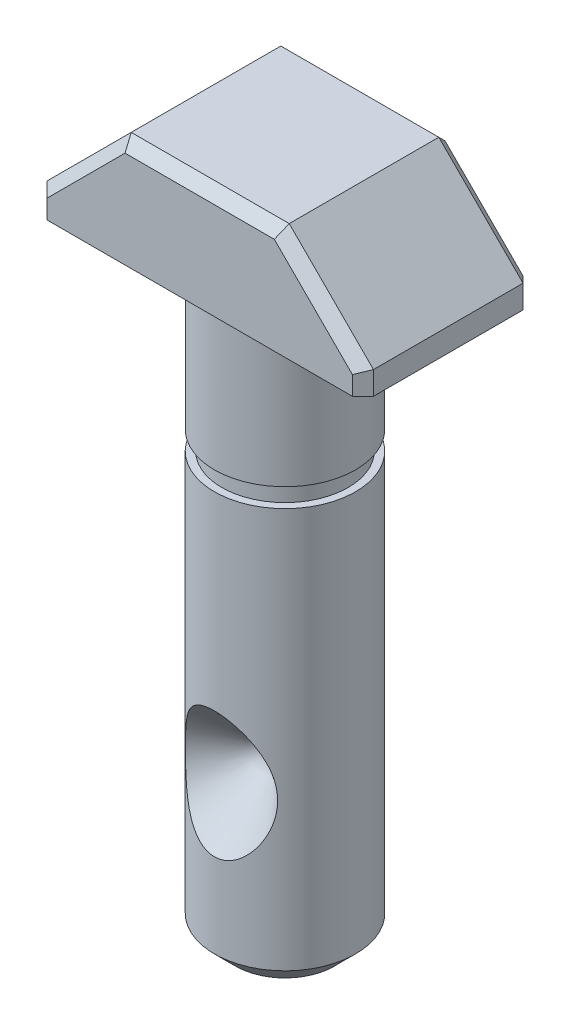
ISO-10303-21;
HEADER;
FILE_DESCRIPTION(('STEP AP214'),'2;1');
FILE_NAME('part.step','',(''),(''),'','','');
FILE_SCHEMA(('AUTOMOTIVE_DESIGN { 1 0 10303 214 1 1 1 1 }'));
ENDSEC;
DATA;
#1=APPLICATION_CONTEXT('core data for automotive mechanical design processes');
#2=APPLICATION_PROTOCOL_DEFINITION('international standard','automotive_design',2000,#1);
#3=PRODUCT_CONTEXT('',#1,'mechanical');
#4=PRODUCT('Part','Part','',(#3));
#5=PRODUCT_RELATED_PRODUCT_CATEGORY('part','',(#4));
#6=PRODUCT_DEFINITION_FORMATION('','',#4);
#7=PRODUCT_DEFINITION_CONTEXT('part definition',#1,'design');
#8=PRODUCT_DEFINITION('design','',#6,#7);
#9=PRODUCT_DEFINITION_SHAPE('','',#8);
#10=(LENGTH_UNIT() NAMED_UNIT(*) SI_UNIT(.MILLI.,.METRE.));
#11=(NAMED_UNIT(*) PLANE_ANGLE_UNIT() SI_UNIT($,.RADIAN.));
#12=(NAMED_UNIT(*) SI_UNIT($,.STERADIAN.) SOLID_ANGLE_UNIT());
#13=UNCERTAINTY_MEASURE_WITH_UNIT(LENGTH_MEASURE(1.E-05),#10,'distance_accuracy_value','');
#14=(GEOMETRIC_REPRESENTATION_CONTEXT(3) GLOBAL_UNCERTAINTY_ASSIGNED_CONTEXT((#13)) GLOBAL_UNIT_ASSIGNED_CONTEXT((#10,
#11,#12)) REPRESENTATION_CONTEXT('',''));
#15=CARTESIAN_POINT('',(0.,0.,0.));
#16=DIRECTION('',(0.,0.,1.));
#17=DIRECTION('',(1.,0.,0.));
#18=AXIS2_PLACEMENT_3D('',#15,#16,#17);
#19=CARTESIAN_POINT('',(0.,-30.45,4.05));
#20=DIRECTION('',(0.,1.,0.));
#21=DIRECTION('',(0.,0.,1.));
#22=AXIS2_PLACEMENT_3D('',#19,#20,#21);
#23=CYLINDRICAL_SURFACE('',#22,3.35);
#24=CARTESIAN_POINT('',(0.,-29.45,4.05));
#25=DIRECTION('',(0.,-1.,0.));
#26=DIRECTION('',(0.,0.,-1.));
#27=AXIS2_PLACEMENT_3D('',#24,#25,#26);
#28=CIRCLE('',#27,3.35);
#29=CARTESIAN_POINT('',(0.,-29.45,0.7));
#30=VERTEX_POINT('',#29);
#31=EDGE_CURVE('E44',#30,#30,#28,.F.);
#32=ORIENTED_EDGE('',*,*,#31,.T.);
#33=EDGE_LOOP('',(#32));
#34=FACE_BOUND('',#33,.T.);
#35=CARTESIAN_POINT('',(0.,-10.45,4.05));
#36=DIRECTION('',(0.,-1.,0.));
#37=DIRECTION('',(0.,0.,-1.));
#38=AXIS2_PLACEMENT_3D('',#35,#36,#37);
#39=CIRCLE('',#38,3.35);
#40=CARTESIAN_POINT('',(0.,-10.45,0.7));
#41=VERTEX_POINT('',#40);
#42=EDGE_CURVE('E329',#41,#41,#39,.T.);
#43=ORIENTED_EDGE('',*,*,#42,.T.);
#44=EDGE_LOOP('',(#43));
#45=FACE_BOUND('',#44,.T.);
#46=CARTESIAN_POINT('',(-1.19391854378407,-24.9657289693853,7.18002532111355));
#47=CARTESIAN_POINT('',(-1.11612140451309,-25.0355882035517,7.20970209310507));
#48=CARTESIAN_POINT('',(-1.03314857265044,-25.1004228308279,7.23803597541151));
#49=CARTESIAN_POINT('',(-0.856875188137191,-25.2169254761135,7.28985716209947));
#50=CARTESIAN_POINT('',(-0.763575209413195,-25.2685942252843,7.31334473560487));
#51=CARTESIAN_POINT('',(-0.588269283336348,-25.3459490763787,7.3488918125953));
#52=CARTESIAN_POINT('',(-0.507950754386,-25.374804179774,7.36231219107361));
#53=CARTESIAN_POINT('',(-0.343155857679018,-25.4199491451651,7.38340955965828));
#54=CARTESIAN_POINT('',(-0.258684614165505,-25.4362540989777,7.39109344767847));
#55=CARTESIAN_POINT('',(-0.0874721450664862,-25.4550523057853,7.3999584558438));
#56=CARTESIAN_POINT('',(-0.000722593547173255,-25.4574847147673,7.401110929523));
#57=CARTESIAN_POINT('',(0.17184329759157,-25.4481512477301,7.39670346828481));
#58=CARTESIAN_POINT('',(0.257659389934,-25.4363816977359,7.39114179645177));
#59=CARTESIAN_POINT('',(0.420625629054954,-25.4007774799206,7.37443795569255));
#60=CARTESIAN_POINT('',(0.497986042733847,-25.3777151578154,7.36365345176558));
#61=CARTESIAN_POINT('',(0.64807744027964,-25.3214445184221,7.33759934610288));
#62=CARTESIAN_POINT('',(0.72080665967469,-25.2882323616945,7.32232804720458));
#63=CARTESIAN_POINT('',(0.893948025663524,-25.1955400351368,7.28026580350678));
#64=CARTESIAN_POINT('',(0.991192204913522,-25.1310644110581,7.25144201271305));
#65=CARTESIAN_POINT('',(1.17324074917015,-24.9881714963678,7.18931742321183));
#66=CARTESIAN_POINT('',(1.25801232312911,-24.9097186138753,7.15600524928929));
#67=CARTESIAN_POINT('',(1.44873033696972,-24.7069165448086,7.07301318150775));
#68=CARTESIAN_POINT('',(1.54850534731283,-24.5771746639537,7.0223609855256));
#69=CARTESIAN_POINT('',(1.72559790573724,-24.302565861726,6.92317131472681));
#70=CARTESIAN_POINT('',(1.80288474081449,-24.1576786191653,6.87463680826072));
#71=CARTESIAN_POINT('',(1.93836327271707,-23.851735317744,6.78351659579261));
#72=CARTESIAN_POINT('',(1.99591052378168,-23.6903239536235,6.74115379423177));
#73=CARTESIAN_POINT('',(2.06560932975737,-23.4416314820097,6.68753708503396));
#74=CARTESIAN_POINT('',(2.08607139290406,-23.3576418725866,6.67131991894416));
#75=CARTESIAN_POINT('',(2.12143679799869,-23.1878597279441,6.64278353435447));
#76=CARTESIAN_POINT('',(2.13634224515595,-23.1020678885671,6.63046283988533));
#77=CARTESIAN_POINT('',(2.16159762445468,-22.9216319947702,6.60935380317779));
#78=CARTESIAN_POINT('',(2.17143674465214,-22.826868573148,6.60096735116864));
#79=CARTESIAN_POINT('',(2.18441326708593,-22.6365460172325,6.58986467132371));
#80=CARTESIAN_POINT('',(2.1875504337132,-22.5409868550834,6.58714864283334));
#81=CARTESIAN_POINT('',(2.1870958673859,-22.3499190497294,6.58754048462083));
#82=CARTESIAN_POINT('',(2.18350571425465,-22.254410399931,6.59064698755316));
#83=CARTESIAN_POINT('',(2.16963007954582,-22.0642421011262,6.60250613860032));
#84=CARTESIAN_POINT('',(2.15934481303389,-21.9695824249475,6.61125860535102));
#85=CARTESIAN_POINT('',(2.13329028704055,-21.7897310326153,6.63298929543632));
#86=CARTESIAN_POINT('',(2.11805337198154,-21.7044111391799,6.64555149587433));
#87=CARTESIAN_POINT('',(2.08207510088183,-21.5355910091039,6.67449838978445));
#88=CARTESIAN_POINT('',(2.06133141214218,-21.452091559872,6.69088470281473));
#89=CARTESIAN_POINT('',(1.99080068283634,-21.2046772788168,6.74495072668712));
#90=CARTESIAN_POINT('',(1.93274281636373,-21.0440468338934,6.78751093555493));
#91=CARTESIAN_POINT('',(1.82583970102984,-20.8055265520498,6.85906624137432));
#92=CARTESIAN_POINT('',(1.78480326765421,-20.7232168247058,6.88543332343856));
#93=CARTESIAN_POINT('',(1.69587512191052,-20.5628433365838,6.93950143186006));
#94=CARTESIAN_POINT('',(1.64798126279409,-20.4847809160452,6.96720287413601));
#95=CARTESIAN_POINT('',(1.49380965875771,-20.2584665115803,7.0507842379841));
#96=CARTESIAN_POINT('',(1.37671556052141,-20.1173351599785,7.10737927100775));
#97=CARTESIAN_POINT('',(1.16997961637191,-19.9203291797971,7.1900657321877));
#98=CARTESIAN_POINT('',(1.09092788384275,-19.8542644615176,7.21862202801113));
#99=CARTESIAN_POINT('',(0.922907685891799,-19.7340936137434,7.27156313177141));
#100=CARTESIAN_POINT('',(0.833954968421617,-19.6799688908051,7.29595441206103));
#101=CARTESIAN_POINT('',(0.662749060125752,-19.5949300766986,7.33475325265499));
#102=CARTESIAN_POINT('',(0.581912714729855,-19.5616374688585,7.35015204998689));
#103=CARTESIAN_POINT('',(0.415238055751134,-19.5077485517985,7.37523023132797));
#104=CARTESIAN_POINT('',(0.329403499495243,-19.4871428368944,7.38491385217744));
#105=CARTESIAN_POINT('',(0.154490789870496,-19.4602192741208,7.39758915428051));
#106=CARTESIAN_POINT('',(0.0653971501341254,-19.4539821735554,7.40054301528219));
#107=CARTESIAN_POINT('',(-0.112509518724617,-19.4566315829299,7.39929134274913));
#108=CARTESIAN_POINT('',(-0.201322564235415,-19.4655171926165,7.39508623538698));
#109=CARTESIAN_POINT('',(-0.367951793979409,-19.4961426249757,7.38068956997201));
#110=CARTESIAN_POINT('',(-0.446046099086863,-19.5166767999174,7.3710600277177));
#111=CARTESIAN_POINT('',(-0.597899544855414,-19.568217972151,7.34711022549434));
#112=CARTESIAN_POINT('',(-0.671656986370861,-19.5992290425218,7.33278814128184));
#113=CARTESIAN_POINT('',(-0.84444356151724,-19.6853633579629,7.29349864168344));
#114=CARTESIAN_POINT('',(-0.94072094104659,-19.7451221693138,7.2666010503224));
#115=CARTESIAN_POINT('',(-1.12159598130449,-19.8784489163925,7.20810279664238));
#116=CARTESIAN_POINT('',(-1.20616451410854,-19.952050253143,7.17649079781624));
#117=CARTESIAN_POINT('',(-1.3973225044095,-20.1432288794206,7.09709635390038));
#118=CARTESIAN_POINT('',(-1.4980077527942,-20.266206210933,7.04814879307165));
#119=CARTESIAN_POINT('',(-1.67789510726211,-20.5272576100185,6.95131228681205));
#120=CARTESIAN_POINT('',(-1.75706646997527,-20.6653528902121,6.90342494519927));
#121=CARTESIAN_POINT('',(-1.89759897738538,-20.9577802179653,6.81203823360655));
#122=CARTESIAN_POINT('',(-1.95828275526634,-21.1124987445016,6.76873693457072));
#123=CARTESIAN_POINT('',(-2.05869836068665,-21.4312146779538,6.69352589585832));
#124=CARTESIAN_POINT('',(-2.09844574298805,-21.5952050956941,6.66160770477522));
#125=CARTESIAN_POINT('',(-2.14402864367905,-21.8561418223065,6.62411512605794));
#126=CARTESIAN_POINT('',(-2.15709359817527,-21.951113796052,6.61312298582488));
#127=CARTESIAN_POINT('',(-2.17643240329876,-22.1422547405437,6.59672558334147));
#128=CARTESIAN_POINT('',(-2.1827059381163,-22.2384237667442,6.59132058090073));
#129=CARTESIAN_POINT('',(-2.18840338446318,-22.431057055145,6.58641545907109));
#130=CARTESIAN_POINT('',(-2.18783121040181,-22.5275211170956,6.58691196517014));
#131=CARTESIAN_POINT('',(-2.17985329527238,-22.7199496520104,6.59377027905638));
#132=CARTESIAN_POINT('',(-2.17244795383059,-22.8159141538605,6.60013174384134));
#133=CARTESIAN_POINT('',(-2.15183166447184,-22.9979751248162,6.61754427479693));
#134=CARTESIAN_POINT('',(-2.13920210193703,-23.0841835460003,6.62812265006486));
#135=CARTESIAN_POINT('',(-2.10839009599211,-23.2550017695494,6.65337911272393));
#136=CARTESIAN_POINT('',(-2.09020529288313,-23.339610876325,6.66805894206246));
#137=CARTESIAN_POINT('',(-2.02729314529908,-23.5906980580618,6.71748348271092));
#138=CARTESIAN_POINT('',(-1.97423793739383,-23.7541711518397,6.75758501304368));
#139=CARTESIAN_POINT('',(-1.87561077549464,-23.9963977287217,6.82602709864213));
#140=CARTESIAN_POINT('',(-1.83791396965888,-24.0793863910002,6.85123686373985));
#141=CARTESIAN_POINT('',(-1.75592157016128,-24.2414883418129,6.90334942679121));
#142=CARTESIAN_POINT('',(-1.71162379574775,-24.3206003380977,6.9302527825509));
#143=CARTESIAN_POINT('',(-1.56885749253727,-24.5504792124151,7.01195891334247));
#144=CARTESIAN_POINT('',(-1.4600968749884,-24.6948478633235,7.06807414809618));
#145=CARTESIAN_POINT('',(-1.29113799700784,-24.8744874058783,7.1415877659458));
#146=CARTESIAN_POINT('',(-1.24358290224509,-24.9211320333031,7.16108017922319));
#147=CARTESIAN_POINT('',(-1.19391854378407,-24.9657289693853,7.18002532111355));
#148=B_SPLINE_CURVE_WITH_KNOTS('',3,(#46,#47,#48,#49,#50,#51,#52,#53,#54,#55,#56,#57,#58,#59,
#60,#61,#62,#63,#64,#65,#66,#67,#68,#69,#70,#71,#72,#73,#74,#75,#76,#77,#78,#79,#80,#81,#82,#83,
#84,#85,#86,#87,#88,#89,#90,#91,#92,#93,#94,#95,#96,#97,#98,#99,#100,#101,#102,#103,#104,#105,
#106,#107,#108,#109,#110,#111,#112,#113,#114,#115,#116,#117,#118,#119,#120,#121,#122,#123,#124,
#125,#126,#127,#128,#129,#130,#131,#132,#133,#134,#135,#136,#137,#138,#139,#140,#141,#142,#143,
#144,#145,#146,#147),.UNSPECIFIED.,.T.,.F.,(4,2,2,2,2,2,2,2,2,2,2,2,2,2,2,2,2,2,2,2,2,2,2,2,2,2,
2,2,2,2,2,2,2,2,2,2,2,2,2,2,2,2,2,2,2,2,2,2,2,2,4),(0.,0.325925007745181,0.651831911438088,
0.909949626707795,1.16775646300443,1.42669315764117,1.68569685225404,1.92904375385996,
2.17248282195446,2.53101145179967,2.89046644379949,3.4016882118905,3.91360493370094,
4.44092300755401,4.70455917669894,4.96809536147637,5.25462046079417,5.54115563281702,
5.82762352422403,6.11408221394021,6.37651348564907,6.63905610253746,7.16474740758285,
7.45147675353489,7.73829605847591,8.30940374052389,8.6292264073813,8.9485474615339,
9.21378743787229,9.4788305356713,9.74535950050813,10.0118725994602,10.2548278217844,
10.49787760616,10.8453165849162,11.1936049222541,11.6898313256345,12.186763152057,
12.7001672965388,13.2131894658357,13.5023204289847,13.7914648365173,14.0804439177923,
14.3694060996842,14.6324063191048,14.8955184087993,15.4225380138338,15.7059718762279,
15.9894995846793,16.5530473182078,16.7611122492291),.UNSPECIFIED.);
#149=CARTESIAN_POINT('',(-1.19391854378407,-24.9657289693853,7.18002532111355));
#150=VERTEX_POINT('',#149);
#151=EDGE_CURVE('E11',#150,#150,#148,.T.);
#152=ORIENTED_EDGE('',*,*,#151,.F.);
#153=EDGE_LOOP('',(#152));
#154=FACE_BOUND('',#153,.T.);
#155=ADVANCED_FACE('F32',(#34,#45,#154),#23,.T.);
#156=CARTESIAN_POINT('',(0.,-9.55,4.05));
#157=DIRECTION('',(0.,-1.,0.));
#158=DIRECTION('',(0.,0.,-1.));
#159=AXIS2_PLACEMENT_3D('',#156,#157,#158);
#160=PLANE('',#159);
#161=CARTESIAN_POINT('',(0.,-9.55,4.05));
#162=DIRECTION('',(0.,-1.,0.));
#163=DIRECTION('',(0.,0.,-1.));
#164=AXIS2_PLACEMENT_3D('',#161,#162,#163);
#165=CIRCLE('',#164,3.35);
#166=CARTESIAN_POINT('',(0.,-9.55,0.7));
#167=VERTEX_POINT('',#166);
#168=EDGE_CURVE('E300',#167,#167,#165,.T.);
#169=ORIENTED_EDGE('',*,*,#168,.T.);
#170=EDGE_LOOP('',(#169));
#171=FACE_BOUND('',#170,.T.);
#172=CARTESIAN_POINT('',(0.,-9.55,4.05));
#173=DIRECTION('',(0.,-1.,0.));
#174=DIRECTION('',(0.,0.,-1.));
#175=AXIS2_PLACEMENT_3D('',#172,#173,#174);
#176=CIRCLE('',#175,3.);
#177=CARTESIAN_POINT('',(0.,-9.55,1.05));
#178=VERTEX_POINT('',#177);
#179=EDGE_CURVE('E333',#178,#178,#176,.T.);
#180=ORIENTED_EDGE('',*,*,#179,.F.);
#181=EDGE_LOOP('',(#180));
#182=FACE_BOUND('',#181,.T.);
#183=ADVANCED_FACE('F134',(#171,#182),#160,.T.);
#184=CARTESIAN_POINT('',(-7.74999999999999,-2.55,8.1));
#185=DIRECTION('',(0.,1.,0.));
#186=DIRECTION('',(0.,0.,1.));
#187=AXIS2_PLACEMENT_3D('',#184,#185,#186);
#188=PLANE('',#187);
#189=DIRECTION('',(0.,0.,-1.));
#190=VECTOR('',#189,1.);
#191=CARTESIAN_POINT('',(-7.74999999999999,-2.55,8.1));
#192=LINE('',#191,#190);
#193=CARTESIAN_POINT('',(-7.74999999999999,-2.55,7.6));
#194=VERTEX_POINT('',#193);
#195=CARTESIAN_POINT('',(-7.74999999999999,-2.55,0.500000000000002));
#196=VERTEX_POINT('',#195);
#197=EDGE_CURVE('E349',#194,#196,#192,.T.);
#198=ORIENTED_EDGE('',*,*,#197,.T.);
#199=DIRECTION('',(0.707106781186548,0.,-0.707106781186548));
#200=VECTOR('',#199,1.);
#201=CARTESIAN_POINT('',(-7.74999999999999,-2.55,0.5));
#202=LINE('',#201,#200);
#203=CARTESIAN_POINT('',(-7.24999999999999,-2.55,0.));
#204=VERTEX_POINT('',#203);
#205=EDGE_CURVE('E247',#196,#204,#202,.T.);
#206=ORIENTED_EDGE('',*,*,#205,.T.);
#207=DIRECTION('',(1.,0.,0.));
#208=VECTOR('',#207,1.);
#209=CARTESIAN_POINT('',(-7.74999999999999,-2.55,0.));
#210=LINE('',#209,#208);
#211=CARTESIAN_POINT('',(7.25,-2.55,0.));
#212=VERTEX_POINT('',#211);
#213=EDGE_CURVE('E297',#204,#212,#210,.T.);
#214=ORIENTED_EDGE('',*,*,#213,.T.);
#215=DIRECTION('',(0.707106781186548,0.,0.707106781186548));
#216=VECTOR('',#215,1.);
#217=CARTESIAN_POINT('',(7.75000000000001,-2.55,0.5));
#218=LINE('',#217,#216);
#219=CARTESIAN_POINT('',(7.75000000000001,-2.55,0.500000000000002));
#220=VERTEX_POINT('',#219);
#221=EDGE_CURVE('E240',#212,#220,#218,.T.);
#222=ORIENTED_EDGE('',*,*,#221,.T.);
#223=DIRECTION('',(0.,0.,-1.));
#224=VECTOR('',#223,1.);
#225=CARTESIAN_POINT('',(7.75000000000001,-2.55,8.1));
#226=LINE('',#225,#224);
#227=CARTESIAN_POINT('',(7.75000000000001,-2.55,7.6));
#228=VERTEX_POINT('',#227);
#229=EDGE_CURVE('E344',#228,#220,#226,.T.);
#230=ORIENTED_EDGE('',*,*,#229,.F.);
#231=DIRECTION('',(0.707106781186548,0.,-0.707106781186548));
#232=VECTOR('',#231,1.);
#233=CARTESIAN_POINT('',(7.25000000000001,-2.55,8.1));
#234=LINE('',#233,#232);
#235=CARTESIAN_POINT('',(7.25,-2.55,8.1));
#236=VERTEX_POINT('',#235);
#237=EDGE_CURVE('E237',#228,#236,#234,.F.);
#238=ORIENTED_EDGE('',*,*,#237,.T.);
#239=DIRECTION('',(1.,0.,0.));
#240=VECTOR('',#239,1.);
#241=CARTESIAN_POINT('',(-7.74999999999999,-2.55,8.1));
#242=LINE('',#241,#240);
#243=CARTESIAN_POINT('',(-7.24999999999999,-2.55,8.1));
#244=VERTEX_POINT('',#243);
#245=EDGE_CURVE('E341',#244,#236,#242,.T.);
#246=ORIENTED_EDGE('',*,*,#245,.F.);
#247=DIRECTION('',(0.707106781186548,0.,0.707106781186548));
#248=VECTOR('',#247,1.);
#249=CARTESIAN_POINT('',(-7.24999999999999,-2.55,8.1));
#250=LINE('',#249,#248);
#251=EDGE_CURVE('E229',#244,#194,#250,.F.);
#252=ORIENTED_EDGE('',*,*,#251,.T.);
#253=EDGE_LOOP('',(#198,#206,#214,#222,#230,#238,#246,#252));
#254=FACE_BOUND('',#253,.T.);
#255=CARTESIAN_POINT('',(0.,-2.55,4.05));
#256=DIRECTION('',(0.,1.,0.));
#257=DIRECTION('',(0.,0.,1.));
#258=AXIS2_PLACEMENT_3D('',#255,#256,#257);
#259=CIRCLE('',#258,3.35);
#260=CARTESIAN_POINT('',(0.,-2.55,7.4));
#261=VERTEX_POINT('',#260);
#262=EDGE_CURVE('E283',#261,#261,#259,.F.);
#263=ORIENTED_EDGE('',*,*,#262,.F.);
#264=EDGE_LOOP('',(#263));
#265=FACE_BOUND('',#264,.T.);
#266=ADVANCED_FACE('F139',(#254,#265),#188,.F.);
#267=CARTESIAN_POINT('',(7.75000000000001,-2.55,8.1));
#268=DIRECTION('',(-1.,0.,0.));
#269=DIRECTION('',(0.,0.,1.));
#270=AXIS2_PLACEMENT_3D('',#267,#268,#269);
#271=PLANE('',#270);
#272=ORIENTED_EDGE('',*,*,#229,.T.);
#273=DIRECTION('',(0.,1.,0.));
#274=VECTOR('',#273,1.);
#275=CARTESIAN_POINT('',(7.75000000000001,-1.45000000000001,0.5));
#276=LINE('',#275,#274);
#277=CARTESIAN_POINT('',(7.75000000000001,-1.45000000000001,0.5));
#278=VERTEX_POINT('',#277);
#279=EDGE_CURVE('E273',#220,#278,#276,.T.);
#280=ORIENTED_EDGE('',*,*,#279,.T.);
#281=DIRECTION('',(0.,0.,1.));
#282=VECTOR('',#281,1.);
#283=CARTESIAN_POINT('',(7.75000000000001,-1.45000000000001,8.1));
#284=LINE('',#283,#282);
#285=CARTESIAN_POINT('',(7.75000000000001,-1.45000000000001,7.6));
#286=VERTEX_POINT('',#285);
#287=EDGE_CURVE('E357',#278,#286,#284,.T.);
#288=ORIENTED_EDGE('',*,*,#287,.T.);
#289=DIRECTION('',(0.,-1.,0.));
#290=VECTOR('',#289,1.);
#291=CARTESIAN_POINT('',(7.75000000000001,-2.55,7.6));
#292=LINE('',#291,#290);
#293=EDGE_CURVE('E271',#286,#228,#292,.T.);
#294=ORIENTED_EDGE('',*,*,#293,.T.);
#295=EDGE_LOOP('',(#272,#280,#288,#294));
#296=FACE_BOUND('',#295,.T.);
#297=ADVANCED_FACE('F169',(#296),#271,.F.);
#298=CARTESIAN_POINT('',(-7.74999999999999,2.55,8.1));
#299=DIRECTION('',(0.,-1.,0.));
#300=DIRECTION('',(0.,0.,-1.));
#301=AXIS2_PLACEMENT_3D('',#298,#299,#300);
#302=PLANE('',#301);
#303=DIRECTION('',(0.,0.,-1.));
#304=VECTOR('',#303,1.);
#305=CARTESIAN_POINT('',(3.75000000000001,2.55,8.1));
#306=LINE('',#305,#304);
#307=CARTESIAN_POINT('',(3.75000000000001,2.55,7.6));
#308=VERTEX_POINT('',#307);
#309=CARTESIAN_POINT('',(3.75000000000001,2.55,0.5));
#310=VERTEX_POINT('',#309);
#311=EDGE_CURVE('E354',#308,#310,#306,.T.);
#312=ORIENTED_EDGE('',*,*,#311,.T.);
#313=DIRECTION('',(-1.,0.,0.));
#314=VECTOR('',#313,1.);
#315=CARTESIAN_POINT('',(-3.74999999999998,2.55,0.5));
#316=LINE('',#315,#314);
#317=CARTESIAN_POINT('',(-3.74999999999998,2.55,0.5));
#318=VERTEX_POINT('',#317);
#319=EDGE_CURVE('E265',#310,#318,#316,.T.);
#320=ORIENTED_EDGE('',*,*,#319,.T.);
#321=DIRECTION('',(0.,0.,1.));
#322=VECTOR('',#321,1.);
#323=CARTESIAN_POINT('',(-3.74999999999998,2.55,8.1));
#324=LINE('',#323,#322);
#325=CARTESIAN_POINT('',(-3.74999999999998,2.55,7.6));
#326=VERTEX_POINT('',#325);
#327=EDGE_CURVE('E351',#318,#326,#324,.T.);
#328=ORIENTED_EDGE('',*,*,#327,.T.);
#329=DIRECTION('',(1.,0.,0.));
#330=VECTOR('',#329,1.);
#331=CARTESIAN_POINT('',(-7.74999999999999,2.55,7.6));
#332=LINE('',#331,#330);
#333=EDGE_CURVE('E263',#326,#308,#332,.T.);
#334=ORIENTED_EDGE('',*,*,#333,.T.);
#335=EDGE_LOOP('',(#312,#320,#328,#334));
#336=FACE_BOUND('',#335,.T.);
#337=ADVANCED_FACE('F173',(#336),#302,.F.);
#338=CARTESIAN_POINT('',(-7.74999999999999,-2.55,8.1));
#339=DIRECTION('',(1.,0.,0.));
#340=DIRECTION('',(0.,0.,-1.));
#341=AXIS2_PLACEMENT_3D('',#338,#339,#340);
#342=PLANE('',#341);
#343=DIRECTION('',(0.,0.,-1.));
#344=VECTOR('',#343,1.);
#345=CARTESIAN_POINT('',(-7.74999999999999,-1.45,8.1));
#346=LINE('',#345,#344);
#347=CARTESIAN_POINT('',(-7.74999999999999,-1.45,7.6));
#348=VERTEX_POINT('',#347);
#349=CARTESIAN_POINT('',(-7.74999999999999,-1.45,0.5));
#350=VERTEX_POINT('',#349);
#351=EDGE_CURVE('E360',#348,#350,#346,.T.);
#352=ORIENTED_EDGE('',*,*,#351,.T.);
#353=DIRECTION('',(0.,-1.,0.));
#354=VECTOR('',#353,1.);
#355=CARTESIAN_POINT('',(-7.74999999999999,-2.55,0.5));
#356=LINE('',#355,#354);
#357=EDGE_CURVE('E238',#350,#196,#356,.T.);
#358=ORIENTED_EDGE('',*,*,#357,.T.);
#359=ORIENTED_EDGE('',*,*,#197,.F.);
#360=DIRECTION('',(0.,1.,0.));
#361=VECTOR('',#360,1.);
#362=CARTESIAN_POINT('',(-7.74999999999999,-2.55,7.6));
#363=LINE('',#362,#361);
#364=EDGE_CURVE('E233',#194,#348,#363,.T.);
#365=ORIENTED_EDGE('',*,*,#364,.T.);
#366=EDGE_LOOP('',(#352,#358,#359,#365));
#367=FACE_BOUND('',#366,.T.);
#368=ADVANCED_FACE('F162',(#367),#342,.F.);
#369=CARTESIAN_POINT('',(7.75000000000001,2.55,8.1));
#370=DIRECTION('',(0.,0.,-1.));
#371=DIRECTION('',(-1.,0.,0.));
#372=AXIS2_PLACEMENT_3D('',#369,#370,#371);
#373=PLANE('',#372);
#374=ORIENTED_EDGE('',*,*,#245,.T.);
#375=DIRECTION('',(0.,1.,0.));
#376=VECTOR('',#375,1.);
#377=CARTESIAN_POINT('',(7.25000000000001,2.55,8.1));
#378=LINE('',#377,#376);
#379=CARTESIAN_POINT('',(7.25000000000001,-1.65710678118655,8.1));
#380=VERTEX_POINT('',#379);
#381=EDGE_CURVE('E281',#236,#380,#378,.T.);
#382=ORIENTED_EDGE('',*,*,#381,.T.);
#383=DIRECTION('',(-0.707106781186546,0.707106781186549,0.));
#384=VECTOR('',#383,1.);
#385=CARTESIAN_POINT('',(3.39644660940673,2.19644660940673,8.1));
#386=LINE('',#385,#384);
#387=CARTESIAN_POINT('',(3.54289321881346,2.05,8.1));
#388=VERTEX_POINT('',#387);
#389=EDGE_CURVE('E58',#380,#388,#386,.T.);
#390=ORIENTED_EDGE('',*,*,#389,.T.);
#391=DIRECTION('',(-1.,0.,0.));
#392=VECTOR('',#391,1.);
#393=CARTESIAN_POINT('',(7.75000000000001,2.05,8.1));
#394=LINE('',#393,#392);
#395=CARTESIAN_POINT('',(-3.54289321881344,2.05,8.1));
#396=VERTEX_POINT('',#395);
#397=EDGE_CURVE('E278',#388,#396,#394,.T.);
#398=ORIENTED_EDGE('',*,*,#397,.T.);
#399=DIRECTION('',(-0.707106781186549,-0.707106781186546,0.));
#400=VECTOR('',#399,1.);
#401=CARTESIAN_POINT('',(-7.39644660940672,-1.80355339059327,8.1));
#402=LINE('',#401,#400);
#403=CARTESIAN_POINT('',(-7.24999999999999,-1.65710678118654,8.1));
#404=VERTEX_POINT('',#403);
#405=EDGE_CURVE('E276',#396,#404,#402,.T.);
#406=ORIENTED_EDGE('',*,*,#405,.T.);
#407=DIRECTION('',(0.,-1.,0.));
#408=VECTOR('',#407,1.);
#409=CARTESIAN_POINT('',(-7.24999999999999,2.55,8.1));
#410=LINE('',#409,#408);
#411=EDGE_CURVE('E231',#404,#244,#410,.T.);
#412=ORIENTED_EDGE('',*,*,#411,.T.);
#413=EDGE_LOOP('',(#374,#382,#390,#398,#406,#412));
#414=FACE_BOUND('',#413,.T.);
#415=ADVANCED_FACE('F158',(#414),#373,.F.);
#416=CARTESIAN_POINT('',(7.75000000000001,2.55,0.));
#417=DIRECTION('',(0.,0.,-1.));
#418=DIRECTION('',(-1.,0.,0.));
#419=AXIS2_PLACEMENT_3D('',#416,#417,#418);
#420=PLANE('',#419);
#421=ORIENTED_EDGE('',*,*,#213,.F.);
#422=DIRECTION('',(0.,1.,0.));
#423=VECTOR('',#422,1.);
#424=CARTESIAN_POINT('',(-7.24999999999999,-1.45,0.));
#425=LINE('',#424,#423);
#426=CARTESIAN_POINT('',(-7.24999999999999,-1.65710678118654,0.));
#427=VERTEX_POINT('',#426);
#428=EDGE_CURVE('E257',#204,#427,#425,.T.);
#429=ORIENTED_EDGE('',*,*,#428,.T.);
#430=DIRECTION('',(0.707106781186549,0.707106781186546,0.));
#431=VECTOR('',#430,1.);
#432=CARTESIAN_POINT('',(2.3535533905933,7.94644660940672,0.));
#433=LINE('',#432,#431);
#434=CARTESIAN_POINT('',(-3.54289321881343,2.05,0.));
#435=VERTEX_POINT('',#434);
#436=EDGE_CURVE('E255',#427,#435,#433,.T.);
#437=ORIENTED_EDGE('',*,*,#436,.T.);
#438=DIRECTION('',(1.,0.,0.));
#439=VECTOR('',#438,1.);
#440=CARTESIAN_POINT('',(3.75000000000001,2.05,0.));
#441=LINE('',#440,#439);
#442=CARTESIAN_POINT('',(3.54289321881346,2.05,0.));
#443=VERTEX_POINT('',#442);
#444=EDGE_CURVE('E253',#435,#443,#441,.T.);
#445=ORIENTED_EDGE('',*,*,#444,.T.);
#446=DIRECTION('',(0.707106781186546,-0.707106781186549,0.));
#447=VECTOR('',#446,1.);
#448=CARTESIAN_POINT('',(5.39644660940673,0.196446609406731,0.));
#449=LINE('',#448,#447);
#450=CARTESIAN_POINT('',(7.25000000000001,-1.65710678118655,0.));
#451=VERTEX_POINT('',#450);
#452=EDGE_CURVE('E251',#443,#451,#449,.T.);
#453=ORIENTED_EDGE('',*,*,#452,.T.);
#454=DIRECTION('',(0.,-1.,0.));
#455=VECTOR('',#454,1.);
#456=CARTESIAN_POINT('',(7.25000000000001,-2.55,0.));
#457=LINE('',#456,#455);
#458=EDGE_CURVE('E249',#451,#212,#457,.T.);
#459=ORIENTED_EDGE('',*,*,#458,.T.);
#460=EDGE_LOOP('',(#421,#429,#437,#445,#453,#459));
#461=FACE_BOUND('',#460,.T.);
#462=ADVANCED_FACE('F161',(#461),#420,.T.);
#463=CARTESIAN_POINT('',(3.75000000000001,2.55,8.1));
#464=DIRECTION('',(-0.707106781186549,-0.707106781186546,0.));
#465=DIRECTION('',(0.707106781186546,-0.707106781186549,0.));
#466=AXIS2_PLACEMENT_3D('',#463,#464,#465);
#467=PLANE('',#466);
#468=ORIENTED_EDGE('',*,*,#287,.F.);
#469=DIRECTION('',(0.707106781186546,-0.707106781186549,0.));
#470=VECTOR('',#469,1.);
#471=CARTESIAN_POINT('',(3.75000000000001,2.55,0.5));
#472=LINE('',#471,#470);
#473=EDGE_CURVE('E269',#278,#310,#472,.F.);
#474=ORIENTED_EDGE('',*,*,#473,.T.);
#475=ORIENTED_EDGE('',*,*,#311,.F.);
#476=DIRECTION('',(-0.707106781186546,0.707106781186549,0.));
#477=VECTOR('',#476,1.);
#478=CARTESIAN_POINT('',(7.75000000000001,-1.45000000000001,7.6));
#479=LINE('',#478,#477);
#480=EDGE_CURVE('E267',#308,#286,#479,.F.);
#481=ORIENTED_EDGE('',*,*,#480,.T.);
#482=EDGE_LOOP('',(#468,#474,#475,#481));
#483=FACE_BOUND('',#482,.T.);
#484=ADVANCED_FACE('F165',(#483),#467,.F.);
#485=CARTESIAN_POINT('',(-7.74999999999999,-1.45,8.1));
#486=DIRECTION('',(0.707106781186546,-0.707106781186549,0.));
#487=DIRECTION('',(0.707106781186549,0.707106781186546,0.));
#488=AXIS2_PLACEMENT_3D('',#485,#486,#487);
#489=PLANE('',#488);
#490=ORIENTED_EDGE('',*,*,#327,.F.);
#491=DIRECTION('',(0.707106781186549,0.707106781186546,0.));
#492=VECTOR('',#491,1.);
#493=CARTESIAN_POINT('',(-7.74999999999999,-1.45,0.500000000000001));
#494=LINE('',#493,#492);
#495=EDGE_CURVE('E261',#318,#350,#494,.F.);
#496=ORIENTED_EDGE('',*,*,#495,.T.);
#497=ORIENTED_EDGE('',*,*,#351,.F.);
#498=DIRECTION('',(-0.707106781186549,-0.707106781186546,0.));
#499=VECTOR('',#498,1.);
#500=CARTESIAN_POINT('',(-3.74999999999998,2.55,7.6));
#501=LINE('',#500,#499);
#502=EDGE_CURVE('E259',#348,#326,#501,.F.);
#503=ORIENTED_EDGE('',*,*,#502,.T.);
#504=EDGE_LOOP('',(#490,#496,#497,#503));
#505=FACE_BOUND('',#504,.T.);
#506=ADVANCED_FACE('F183',(#505),#489,.F.);
#507=CARTESIAN_POINT('',(7.75000000000001,-2.55,0.5));
#508=DIRECTION('',(0.707106781186547,0.,-0.707106781186547));
#509=DIRECTION('',(-0.707106781186548,0.,-0.707106781186548));
#510=AXIS2_PLACEMENT_3D('',#507,#508,#509);
#511=PLANE('',#510);
#512=ORIENTED_EDGE('',*,*,#221,.F.);
#513=ORIENTED_EDGE('',*,*,#458,.F.);
#514=DIRECTION('',(0.678598344545847,0.281084637714818,0.678598344545847));
#515=VECTOR('',#514,1.);
#516=CARTESIAN_POINT('',(7.54018207318641,-1.53690943091521,0.290182073186403));
#517=LINE('',#516,#515);
#518=EDGE_CURVE('E294',#278,#451,#517,.F.);
#519=ORIENTED_EDGE('',*,*,#518,.F.);
#520=ORIENTED_EDGE('',*,*,#279,.F.);
#521=EDGE_LOOP('',(#512,#513,#519,#520));
#522=FACE_BOUND('',#521,.T.);
#523=ADVANCED_FACE('F187',(#522),#511,.T.);
#524=CARTESIAN_POINT('',(5.39644660940673,0.196446609406731,0.));
#525=DIRECTION('',(0.500000000000001,0.499999999999999,-0.707106781186547));
#526=DIRECTION('',(-0.816496580927725,0.,-0.577350269189627));
#527=AXIS2_PLACEMENT_3D('',#524,#525,#526);
#528=PLANE('',#527);
#529=ORIENTED_EDGE('',*,*,#518,.T.);
#530=ORIENTED_EDGE('',*,*,#452,.F.);
#531=DIRECTION('',(0.28108463771482,0.678598344545847,0.678598344545847));
#532=VECTOR('',#531,1.);
#533=CARTESIAN_POINT('',(3.33578643762692,1.55,-0.500000000000002));
#534=LINE('',#533,#532);
#535=EDGE_CURVE('E291',#310,#443,#534,.F.);
#536=ORIENTED_EDGE('',*,*,#535,.F.);
#537=ORIENTED_EDGE('',*,*,#473,.F.);
#538=EDGE_LOOP('',(#529,#530,#536,#537));
#539=FACE_BOUND('',#538,.T.);
#540=ADVANCED_FACE('F201',(#539),#528,.T.);
#541=CARTESIAN_POINT('',(-7.74999999999999,2.55,0.5));
#542=DIRECTION('',(0.,0.707106781186547,-0.707106781186547));
#543=DIRECTION('',(0.,0.707106781186548,0.707106781186548));
#544=AXIS2_PLACEMENT_3D('',#541,#542,#543);
#545=PLANE('',#544);
#546=ORIENTED_EDGE('',*,*,#535,.T.);
#547=ORIENTED_EDGE('',*,*,#444,.F.);
#548=DIRECTION('',(-0.281084637714817,0.678598344545848,0.678598344545848));
#549=VECTOR('',#548,1.);
#550=CARTESIAN_POINT('',(-4.06603429423706,3.31297427932218,1.26297427932218));
#551=LINE('',#550,#549);
#552=EDGE_CURVE('E287',#318,#435,#551,.F.);
#553=ORIENTED_EDGE('',*,*,#552,.F.);
#554=ORIENTED_EDGE('',*,*,#319,.F.);
#555=EDGE_LOOP('',(#546,#547,#553,#554));
#556=FACE_BOUND('',#555,.T.);
#557=ADVANCED_FACE('F197',(#556),#545,.T.);
#558=CARTESIAN_POINT('',(2.3535533905933,7.94644660940672,0.));
#559=DIRECTION('',(-0.5,0.500000000000002,-0.707106781186546));
#560=DIRECTION('',(0.,0.816496580927725,0.577350269189628));
#561=AXIS2_PLACEMENT_3D('',#558,#559,#560);
#562=PLANE('',#561);
#563=ORIENTED_EDGE('',*,*,#552,.T.);
#564=ORIENTED_EDGE('',*,*,#436,.F.);
#565=DIRECTION('',(-0.678598344545848,0.281084637714818,0.678598344545848));
#566=VECTOR('',#565,1.);
#567=CARTESIAN_POINT('',(-4.65942088872887,-2.73015978347547,-2.59057911127112));
#568=LINE('',#567,#566);
#569=EDGE_CURVE('E284',#350,#427,#568,.F.);
#570=ORIENTED_EDGE('',*,*,#569,.F.);
#571=ORIENTED_EDGE('',*,*,#495,.F.);
#572=EDGE_LOOP('',(#563,#564,#570,#571));
#573=FACE_BOUND('',#572,.T.);
#574=ADVANCED_FACE('F193',(#573),#562,.T.);
#575=CARTESIAN_POINT('',(-7.74999999999999,-2.55,0.5));
#576=DIRECTION('',(-0.707106781186547,0.,-0.707106781186547));
#577=DIRECTION('',(-0.707106781186548,0.,0.707106781186548));
#578=AXIS2_PLACEMENT_3D('',#575,#576,#577);
#579=PLANE('',#578);
#580=ORIENTED_EDGE('',*,*,#569,.T.);
#581=ORIENTED_EDGE('',*,*,#428,.F.);
#582=ORIENTED_EDGE('',*,*,#205,.F.);
#583=ORIENTED_EDGE('',*,*,#357,.F.);
#584=EDGE_LOOP('',(#580,#581,#582,#583));
#585=FACE_BOUND('',#584,.T.);
#586=ADVANCED_FACE('F189',(#585),#579,.T.);
#587=CARTESIAN_POINT('',(-7.24999999999999,2.55,8.1));
#588=DIRECTION('',(0.707106781186547,0.,-0.707106781186547));
#589=DIRECTION('',(-0.707106781186548,0.,-0.707106781186548));
#590=AXIS2_PLACEMENT_3D('',#587,#588,#589);
#591=PLANE('',#590);
#592=ORIENTED_EDGE('',*,*,#251,.F.);
#593=ORIENTED_EDGE('',*,*,#411,.F.);
#594=DIRECTION('',(-0.678598344545848,0.281084637714818,-0.678598344545848));
#595=VECTOR('',#594,1.);
#596=CARTESIAN_POINT('',(-8.05247856610181,-1.32470927559346,7.29752143389819));
#597=LINE('',#596,#595);
#598=EDGE_CURVE('E288',#348,#404,#597,.F.);
#599=ORIENTED_EDGE('',*,*,#598,.F.);
#600=ORIENTED_EDGE('',*,*,#364,.F.);
#601=EDGE_LOOP('',(#592,#593,#599,#600));
#602=FACE_BOUND('',#601,.T.);
#603=ADVANCED_FACE('F192',(#602),#591,.F.);
#604=CARTESIAN_POINT('',(2.3535533905933,7.94644660940672,8.1));
#605=DIRECTION('',(0.5,-0.500000000000002,-0.707106781186546));
#606=DIRECTION('',(0.,0.816496580927725,-0.577350269189628));
#607=AXIS2_PLACEMENT_3D('',#604,#605,#606);
#608=PLANE('',#607);
#609=ORIENTED_EDGE('',*,*,#598,.T.);
#610=ORIENTED_EDGE('',*,*,#405,.F.);
#611=DIRECTION('',(-0.281084637714817,0.678598344545848,-0.678598344545848));
#612=VECTOR('',#611,1.);
#613=CARTESIAN_POINT('',(-4.20173265872926,3.6405791112711,6.5094208887289));
#614=LINE('',#613,#612);
#615=EDGE_CURVE('E303',#326,#396,#614,.F.);
#616=ORIENTED_EDGE('',*,*,#615,.F.);
#617=ORIENTED_EDGE('',*,*,#502,.F.);
#618=EDGE_LOOP('',(#609,#610,#616,#617));
#619=FACE_BOUND('',#618,.T.);
#620=ADVANCED_FACE('F218',(#619),#608,.F.);
#621=CARTESIAN_POINT('',(7.75000000000001,2.05,8.1));
#622=DIRECTION('',(0.,-0.707106781186547,-0.707106781186547));
#623=DIRECTION('',(0.,0.707106781186548,-0.707106781186548));
#624=AXIS2_PLACEMENT_3D('',#621,#622,#623);
#625=PLANE('',#624);
#626=ORIENTED_EDGE('',*,*,#615,.T.);
#627=ORIENTED_EDGE('',*,*,#397,.F.);
#628=DIRECTION('',(0.28108463771482,0.678598344545847,-0.678598344545847));
#629=VECTOR('',#628,1.);
#630=CARTESIAN_POINT('',(3.87529072440655,2.85247856610182,7.29752143389818));
#631=LINE('',#630,#629);
#632=EDGE_CURVE('E299',#308,#388,#631,.F.);
#633=ORIENTED_EDGE('',*,*,#632,.F.);
#634=ORIENTED_EDGE('',*,*,#333,.F.);
#635=EDGE_LOOP('',(#626,#627,#633,#634));
#636=FACE_BOUND('',#635,.T.);
#637=ADVANCED_FACE('F214',(#636),#625,.F.);
#638=CARTESIAN_POINT('',(5.39644660940673,0.196446609406731,8.1));
#639=DIRECTION('',(-0.500000000000001,-0.499999999999999,-0.707106781186547));
#640=DIRECTION('',(-0.816496580927725,0.,0.577350269189627));
#641=AXIS2_PLACEMENT_3D('',#638,#639,#640);
#642=PLANE('',#641);
#643=ORIENTED_EDGE('',*,*,#632,.T.);
#644=ORIENTED_EDGE('',*,*,#389,.F.);
#645=DIRECTION('',(0.678598344545847,0.281084637714818,-0.678598344545847));
#646=VECTOR('',#645,1.);
#647=CARTESIAN_POINT('',(6.75,-1.8642135623731,8.6));
#648=LINE('',#647,#646);
#649=EDGE_CURVE('E51',#286,#380,#648,.F.);
#650=ORIENTED_EDGE('',*,*,#649,.F.);
#651=ORIENTED_EDGE('',*,*,#480,.F.);
#652=EDGE_LOOP('',(#643,#644,#650,#651));
#653=FACE_BOUND('',#652,.T.);
#654=ADVANCED_FACE('F211',(#653),#642,.F.);
#655=CARTESIAN_POINT('',(7.25000000000001,2.55,8.1));
#656=DIRECTION('',(-0.707106781186547,0.,-0.707106781186547));
#657=DIRECTION('',(-0.707106781186548,0.,0.707106781186548));
#658=AXIS2_PLACEMENT_3D('',#655,#656,#657);
#659=PLANE('',#658);
#660=ORIENTED_EDGE('',*,*,#237,.F.);
#661=ORIENTED_EDGE('',*,*,#293,.F.);
#662=ORIENTED_EDGE('',*,*,#649,.T.);
#663=ORIENTED_EDGE('',*,*,#381,.F.);
#664=EDGE_LOOP('',(#660,#661,#662,#663));
#665=FACE_BOUND('',#664,.T.);
#666=ADVANCED_FACE('F156',(#665),#659,.F.);
#667=CARTESIAN_POINT('',(0.,-9.55,4.05));
#668=DIRECTION('',(0.,1.,0.));
#669=DIRECTION('',(0.,0.,1.));
#670=AXIS2_PLACEMENT_3D('',#667,#668,#669);
#671=CYLINDRICAL_SURFACE('',#670,3.35);
#672=ORIENTED_EDGE('',*,*,#168,.F.);
#673=EDGE_LOOP('',(#672));
#674=FACE_BOUND('',#673,.T.);
#675=ORIENTED_EDGE('',*,*,#262,.T.);
#676=EDGE_LOOP('',(#675));
#677=FACE_BOUND('',#676,.T.);
#678=ADVANCED_FACE('F151',(#674,#677),#671,.T.);
#679=CARTESIAN_POINT('',(0.,-10.45,4.05));
#680=DIRECTION('',(0.,1.,0.));
#681=DIRECTION('',(0.,0.,1.));
#682=AXIS2_PLACEMENT_3D('',#679,#680,#681);
#683=CYLINDRICAL_SURFACE('',#682,3.);
#684=CARTESIAN_POINT('',(0.,-10.45,4.05));
#685=DIRECTION('',(0.,-1.,0.));
#686=DIRECTION('',(0.,0.,-1.));
#687=AXIS2_PLACEMENT_3D('',#684,#685,#686);
#688=CIRCLE('',#687,3.);
#689=CARTESIAN_POINT('',(0.,-10.45,1.05));
#690=VERTEX_POINT('',#689);
#691=EDGE_CURVE('E332',#690,#690,#688,.T.);
#692=ORIENTED_EDGE('',*,*,#691,.F.);
#693=EDGE_LOOP('',(#692));
#694=FACE_BOUND('',#693,.T.);
#695=ORIENTED_EDGE('',*,*,#179,.T.);
#696=EDGE_LOOP('',(#695));
#697=FACE_BOUND('',#696,.T.);
#698=ADVANCED_FACE('F149',(#694,#697),#683,.T.);
#699=CARTESIAN_POINT('',(0.,-10.45,4.05));
#700=DIRECTION('',(0.,-1.,0.));
#701=DIRECTION('',(0.,0.,-1.));
#702=AXIS2_PLACEMENT_3D('',#699,#700,#701);
#703=PLANE('',#702);
#704=ORIENTED_EDGE('',*,*,#42,.F.);
#705=EDGE_LOOP('',(#704));
#706=FACE_BOUND('',#705,.T.);
#707=ORIENTED_EDGE('',*,*,#691,.T.);
#708=EDGE_LOOP('',(#707));
#709=FACE_BOUND('',#708,.T.);
#710=ADVANCED_FACE('F147',(#706,#709),#703,.F.);
#711=CARTESIAN_POINT('',(0.,-30.45,4.05));
#712=DIRECTION('',(0.,-1.,0.));
#713=DIRECTION('',(0.,0.,-1.));
#714=AXIS2_PLACEMENT_3D('',#711,#712,#713);
#715=PLANE('',#714);
#716=CARTESIAN_POINT('',(0.,-30.45,4.05));
#717=DIRECTION('',(0.,-1.,0.));
#718=DIRECTION('',(0.,0.,-1.));
#719=AXIS2_PLACEMENT_3D('',#716,#717,#718);
#720=CIRCLE('',#719,2.35);
#721=CARTESIAN_POINT('',(0.,-30.45,1.7));
#722=VERTEX_POINT('',#721);
#723=EDGE_CURVE('E309',#722,#722,#720,.T.);
#724=ORIENTED_EDGE('',*,*,#723,.T.);
#725=EDGE_LOOP('',(#724));
#726=FACE_BOUND('',#725,.T.);
#727=ADVANCED_FACE('F315',(#726),#715,.T.);
#728=CARTESIAN_POINT('',(0.,-30.45,4.05));
#729=DIRECTION('',(0.,1.,0.));
#730=DIRECTION('',(0.,0.,1.));
#731=AXIS2_PLACEMENT_3D('',#728,#729,#730);
#732=CONICAL_SURFACE('',#731,2.35,0.785398163397446);
#733=ORIENTED_EDGE('',*,*,#31,.F.);
#734=EDGE_LOOP('',(#733));
#735=FACE_BOUND('',#734,.T.);
#736=ORIENTED_EDGE('',*,*,#723,.F.);
#737=EDGE_LOOP('',(#736));
#738=FACE_BOUND('',#737,.T.);
#739=ADVANCED_FACE('F34',(#735,#738),#732,.T.);
#740=CARTESIAN_POINT('',(0.,-22.4551315709876,4.4));
#741=DIRECTION('',(0.,0.,1.));
#742=DIRECTION('',(1.,0.,0.));
#743=AXIS2_PLACEMENT_3D('',#740,#741,#742);
#744=CONICAL_SURFACE('',#743,0.,0.785398163397448);
#745=CARTESIAN_POINT('',(0.,-22.4551315709876,4.4));
#746=VERTEX_POINT('',#745);
#747=VERTEX_LOOP('',#746);
#748=FACE_BOUND('',#747,.T.);
#749=ORIENTED_EDGE('',*,*,#151,.T.);
#750=EDGE_LOOP('',(#749));
#751=FACE_BOUND('',#750,.T.);
#752=ADVANCED_FACE('F128',(#748,#751),#744,.F.);
#753=CLOSED_SHELL('',(#155,#183,#266,#297,#337,#368,#415,#462,#484,#506,#523,#540,#557,#574,
#586,#603,#620,#637,#654,#666,#678,#698,#710,#727,#739,#752));
#754=MANIFOLD_SOLID_BREP('B2',#753);
#755=ADVANCED_BREP_SHAPE_REPRESENTATION('',(#18,#754),#14);
#756=SHAPE_DEFINITION_REPRESENTATION(#9,#755);
ENDSEC;
END-ISO-10303-21;
